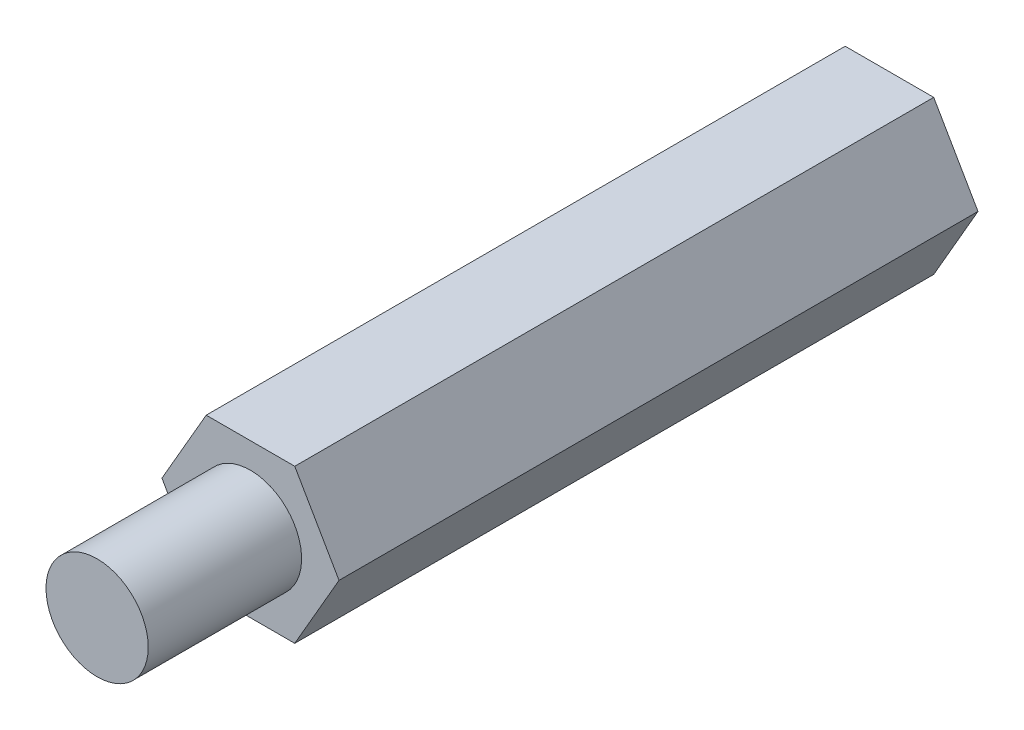
ISO-10303-21;
HEADER;
FILE_DESCRIPTION(('STEP AP214'),'2;1');
FILE_NAME('part.step','',(''),(''),'','','');
FILE_SCHEMA(('AUTOMOTIVE_DESIGN { 1 0 10303 214 1 1 1 1 }'));
ENDSEC;
DATA;
#1=APPLICATION_CONTEXT('core data for automotive mechanical design processes');
#2=APPLICATION_PROTOCOL_DEFINITION('international standard','automotive_design',2000,#1);
#3=PRODUCT_CONTEXT('',#1,'mechanical');
#4=PRODUCT('Part','Part','',(#3));
#5=PRODUCT_RELATED_PRODUCT_CATEGORY('part','',(#4));
#6=PRODUCT_DEFINITION_FORMATION('','',#4);
#7=PRODUCT_DEFINITION_CONTEXT('part definition',#1,'design');
#8=PRODUCT_DEFINITION('design','',#6,#7);
#9=PRODUCT_DEFINITION_SHAPE('','',#8);
#10=(LENGTH_UNIT() NAMED_UNIT(*) SI_UNIT(.MILLI.,.METRE.));
#11=(NAMED_UNIT(*) PLANE_ANGLE_UNIT() SI_UNIT($,.RADIAN.));
#12=(NAMED_UNIT(*) SI_UNIT($,.STERADIAN.) SOLID_ANGLE_UNIT());
#13=UNCERTAINTY_MEASURE_WITH_UNIT(LENGTH_MEASURE(1.E-05),#10,'distance_accuracy_value','');
#14=(GEOMETRIC_REPRESENTATION_CONTEXT(3) GLOBAL_UNCERTAINTY_ASSIGNED_CONTEXT((#13)) GLOBAL_UNIT_ASSIGNED_CONTEXT((#10,
#11,#12)) REPRESENTATION_CONTEXT('',''));
#15=CARTESIAN_POINT('',(0.,0.,0.));
#16=DIRECTION('',(0.,0.,1.));
#17=DIRECTION('',(1.,0.,0.));
#18=AXIS2_PLACEMENT_3D('',#15,#16,#17);
#19=CARTESIAN_POINT('',(-5.19615242270663,-3.,25.));
#20=DIRECTION('',(0.,0.,-1.));
#21=DIRECTION('',(-1.,0.,0.));
#22=AXIS2_PLACEMENT_3D('',#19,#20,#21);
#23=PLANE('',#22);
#24=DIRECTION('',(1.,0.,0.));
#25=VECTOR('',#24,1.);
#26=CARTESIAN_POINT('',(-1.73205080756888,-3.,25.));
#27=LINE('',#26,#25);
#28=CARTESIAN_POINT('',(-1.73205080756888,-3.,25.));
#29=VERTEX_POINT('',#28);
#30=CARTESIAN_POINT('',(1.73205080756888,-3.,25.));
#31=VERTEX_POINT('',#30);
#32=EDGE_CURVE('E138',#29,#31,#27,.T.);
#33=ORIENTED_EDGE('',*,*,#32,.T.);
#34=DIRECTION('',(0.5,0.866025403784439,0.));
#35=VECTOR('',#34,1.);
#36=CARTESIAN_POINT('',(1.73205080756888,-3.,25.));
#37=LINE('',#36,#35);
#38=CARTESIAN_POINT('',(3.46410161513776,0.,25.));
#39=VERTEX_POINT('',#38);
#40=EDGE_CURVE('E95',#31,#39,#37,.T.);
#41=ORIENTED_EDGE('',*,*,#40,.T.);
#42=DIRECTION('',(-0.5,0.866025403784438,0.));
#43=VECTOR('',#42,1.);
#44=CARTESIAN_POINT('',(3.46410161513776,0.,25.));
#45=LINE('',#44,#43);
#46=CARTESIAN_POINT('',(1.73205080756888,3.,25.));
#47=VERTEX_POINT('',#46);
#48=EDGE_CURVE('E109',#39,#47,#45,.T.);
#49=ORIENTED_EDGE('',*,*,#48,.T.);
#50=DIRECTION('',(-1.,0.,0.));
#51=VECTOR('',#50,1.);
#52=CARTESIAN_POINT('',(1.73205080756888,3.,25.));
#53=LINE('',#52,#51);
#54=CARTESIAN_POINT('',(-1.73205080756888,3.,25.));
#55=VERTEX_POINT('',#54);
#56=EDGE_CURVE('E103',#47,#55,#53,.T.);
#57=ORIENTED_EDGE('',*,*,#56,.T.);
#58=DIRECTION('',(-0.5,-0.866025403784439,0.));
#59=VECTOR('',#58,1.);
#60=CARTESIAN_POINT('',(-1.73205080756888,3.,25.));
#61=LINE('',#60,#59);
#62=CARTESIAN_POINT('',(-3.46410161513775,0.,25.));
#63=VERTEX_POINT('',#62);
#64=EDGE_CURVE('E107',#55,#63,#61,.T.);
#65=ORIENTED_EDGE('',*,*,#64,.T.);
#66=DIRECTION('',(0.5,-0.866025403784438,0.));
#67=VECTOR('',#66,1.);
#68=CARTESIAN_POINT('',(-3.46410161513775,0.,25.));
#69=LINE('',#68,#67);
#70=EDGE_CURVE('E56',#63,#29,#69,.T.);
#71=ORIENTED_EDGE('',*,*,#70,.T.);
#72=EDGE_LOOP('',(#33,#41,#49,#57,#65,#71));
#73=FACE_BOUND('',#72,.T.);
#74=CARTESIAN_POINT('',(0.,0.,25.));
#75=DIRECTION('',(0.,0.,-1.));
#76=DIRECTION('',(-1.,0.,0.));
#77=AXIS2_PLACEMENT_3D('',#74,#75,#76);
#78=CIRCLE('',#77,2.);
#79=CARTESIAN_POINT('',(-2.,0.,25.));
#80=VERTEX_POINT('',#79);
#81=EDGE_CURVE('E11',#80,#80,#78,.F.);
#82=ORIENTED_EDGE('',*,*,#81,.F.);
#83=EDGE_LOOP('',(#82));
#84=FACE_BOUND('',#83,.T.);
#85=ADVANCED_FACE('F39',(#73,#84),#23,.F.);
#86=CARTESIAN_POINT('',(-1.73205080756888,-3.,25.));
#87=DIRECTION('',(0.,1.,0.));
#88=DIRECTION('',(0.,0.,1.));
#89=AXIS2_PLACEMENT_3D('',#86,#87,#88);
#90=PLANE('',#89);
#91=DIRECTION('',(1.,0.,0.));
#92=VECTOR('',#91,1.);
#93=CARTESIAN_POINT('',(-1.73205080756888,-3.,0.));
#94=LINE('',#93,#92);
#95=CARTESIAN_POINT('',(-1.73205080756888,-3.,0.));
#96=VERTEX_POINT('',#95);
#97=CARTESIAN_POINT('',(1.73205080756888,-3.,0.));
#98=VERTEX_POINT('',#97);
#99=EDGE_CURVE('E127',#96,#98,#94,.T.);
#100=ORIENTED_EDGE('',*,*,#99,.T.);
#101=DIRECTION('',(0.,0.,-1.));
#102=VECTOR('',#101,1.);
#103=CARTESIAN_POINT('',(1.73205080756888,-3.,25.));
#104=LINE('',#103,#102);
#105=EDGE_CURVE('E48',#31,#98,#104,.T.);
#106=ORIENTED_EDGE('',*,*,#105,.F.);
#107=ORIENTED_EDGE('',*,*,#32,.F.);
#108=DIRECTION('',(0.,0.,-1.));
#109=VECTOR('',#108,1.);
#110=CARTESIAN_POINT('',(-1.73205080756888,-3.,25.));
#111=LINE('',#110,#109);
#112=EDGE_CURVE('E123',#29,#96,#111,.T.);
#113=ORIENTED_EDGE('',*,*,#112,.T.);
#114=EDGE_LOOP('',(#100,#106,#107,#113));
#115=FACE_BOUND('',#114,.T.);
#116=ADVANCED_FACE('F41',(#115),#90,.F.);
#117=CARTESIAN_POINT('',(1.73205080756888,-3.,25.));
#118=DIRECTION('',(-0.866025403784439,0.5,0.));
#119=DIRECTION('',(-0.5,-0.866025403784439,0.));
#120=AXIS2_PLACEMENT_3D('',#117,#118,#119);
#121=PLANE('',#120);
#122=DIRECTION('',(0.5,0.866025403784439,0.));
#123=VECTOR('',#122,1.);
#124=CARTESIAN_POINT('',(1.73205080756888,-3.,0.));
#125=LINE('',#124,#123);
#126=CARTESIAN_POINT('',(3.46410161513776,0.,0.));
#127=VERTEX_POINT('',#126);
#128=EDGE_CURVE('E130',#98,#127,#125,.T.);
#129=ORIENTED_EDGE('',*,*,#128,.T.);
#130=DIRECTION('',(0.,0.,-1.));
#131=VECTOR('',#130,1.);
#132=CARTESIAN_POINT('',(3.46410161513776,0.,25.));
#133=LINE('',#132,#131);
#134=EDGE_CURVE('E142',#39,#127,#133,.T.);
#135=ORIENTED_EDGE('',*,*,#134,.F.);
#136=ORIENTED_EDGE('',*,*,#40,.F.);
#137=ORIENTED_EDGE('',*,*,#105,.T.);
#138=EDGE_LOOP('',(#129,#135,#136,#137));
#139=FACE_BOUND('',#138,.T.);
#140=ADVANCED_FACE('F145',(#139),#121,.F.);
#141=CARTESIAN_POINT('',(3.46410161513776,0.,25.));
#142=DIRECTION('',(-0.866025403784438,-0.5,0.));
#143=DIRECTION('',(0.5,-0.866025403784438,0.));
#144=AXIS2_PLACEMENT_3D('',#141,#142,#143);
#145=PLANE('',#144);
#146=DIRECTION('',(-0.5,0.866025403784438,0.));
#147=VECTOR('',#146,1.);
#148=CARTESIAN_POINT('',(3.46410161513776,0.,0.));
#149=LINE('',#148,#147);
#150=CARTESIAN_POINT('',(1.73205080756888,3.,0.));
#151=VERTEX_POINT('',#150);
#152=EDGE_CURVE('E133',#127,#151,#149,.T.);
#153=ORIENTED_EDGE('',*,*,#152,.T.);
#154=DIRECTION('',(0.,0.,-1.));
#155=VECTOR('',#154,1.);
#156=CARTESIAN_POINT('',(1.73205080756888,3.,25.));
#157=LINE('',#156,#155);
#158=EDGE_CURVE('E118',#47,#151,#157,.T.);
#159=ORIENTED_EDGE('',*,*,#158,.F.);
#160=ORIENTED_EDGE('',*,*,#48,.F.);
#161=ORIENTED_EDGE('',*,*,#134,.T.);
#162=EDGE_LOOP('',(#153,#159,#160,#161));
#163=FACE_BOUND('',#162,.T.);
#164=ADVANCED_FACE('F153',(#163),#145,.F.);
#165=CARTESIAN_POINT('',(1.73205080756888,3.,25.));
#166=DIRECTION('',(0.,-1.,0.));
#167=DIRECTION('',(1.,0.,0.));
#168=AXIS2_PLACEMENT_3D('',#165,#166,#167);
#169=PLANE('',#168);
#170=DIRECTION('',(-1.,0.,0.));
#171=VECTOR('',#170,1.);
#172=CARTESIAN_POINT('',(1.73205080756888,3.,0.));
#173=LINE('',#172,#171);
#174=CARTESIAN_POINT('',(-1.73205080756888,3.,0.));
#175=VERTEX_POINT('',#174);
#176=EDGE_CURVE('E117',#151,#175,#173,.T.);
#177=ORIENTED_EDGE('',*,*,#176,.T.);
#178=DIRECTION('',(0.,0.,-1.));
#179=VECTOR('',#178,1.);
#180=CARTESIAN_POINT('',(-1.73205080756888,3.,25.));
#181=LINE('',#180,#179);
#182=EDGE_CURVE('E114',#55,#175,#181,.T.);
#183=ORIENTED_EDGE('',*,*,#182,.F.);
#184=ORIENTED_EDGE('',*,*,#56,.F.);
#185=ORIENTED_EDGE('',*,*,#158,.T.);
#186=EDGE_LOOP('',(#177,#183,#184,#185));
#187=FACE_BOUND('',#186,.T.);
#188=ADVANCED_FACE('F115',(#187),#169,.F.);
#189=CARTESIAN_POINT('',(-1.73205080756888,3.,25.));
#190=DIRECTION('',(0.866025403784439,-0.5,0.));
#191=DIRECTION('',(0.5,0.866025403784439,0.));
#192=AXIS2_PLACEMENT_3D('',#189,#190,#191);
#193=PLANE('',#192);
#194=DIRECTION('',(-0.5,-0.866025403784439,0.));
#195=VECTOR('',#194,1.);
#196=CARTESIAN_POINT('',(-1.73205080756888,3.,0.));
#197=LINE('',#196,#195);
#198=CARTESIAN_POINT('',(-3.46410161513775,0.,0.));
#199=VERTEX_POINT('',#198);
#200=EDGE_CURVE('E80',#175,#199,#197,.T.);
#201=ORIENTED_EDGE('',*,*,#200,.T.);
#202=DIRECTION('',(0.,0.,-1.));
#203=VECTOR('',#202,1.);
#204=CARTESIAN_POINT('',(-3.46410161513775,0.,25.));
#205=LINE('',#204,#203);
#206=EDGE_CURVE('E119',#63,#199,#205,.T.);
#207=ORIENTED_EDGE('',*,*,#206,.F.);
#208=ORIENTED_EDGE('',*,*,#64,.F.);
#209=ORIENTED_EDGE('',*,*,#182,.T.);
#210=EDGE_LOOP('',(#201,#207,#208,#209));
#211=FACE_BOUND('',#210,.T.);
#212=ADVANCED_FACE('F121',(#211),#193,.F.);
#213=CARTESIAN_POINT('',(-3.46410161513775,0.,25.));
#214=DIRECTION('',(0.866025403784438,0.5,0.));
#215=DIRECTION('',(-0.5,0.866025403784439,0.));
#216=AXIS2_PLACEMENT_3D('',#213,#214,#215);
#217=PLANE('',#216);
#218=DIRECTION('',(0.5,-0.866025403784438,0.));
#219=VECTOR('',#218,1.);
#220=CARTESIAN_POINT('',(-3.46410161513775,0.,0.));
#221=LINE('',#220,#219);
#222=EDGE_CURVE('E86',#199,#96,#221,.T.);
#223=ORIENTED_EDGE('',*,*,#222,.T.);
#224=ORIENTED_EDGE('',*,*,#112,.F.);
#225=ORIENTED_EDGE('',*,*,#70,.F.);
#226=ORIENTED_EDGE('',*,*,#206,.T.);
#227=EDGE_LOOP('',(#223,#224,#225,#226));
#228=FACE_BOUND('',#227,.T.);
#229=ADVANCED_FACE('F177',(#228),#217,.F.);
#230=CARTESIAN_POINT('',(-5.19615242270663,-3.,0.));
#231=DIRECTION('',(0.,0.,-1.));
#232=DIRECTION('',(-1.,0.,0.));
#233=AXIS2_PLACEMENT_3D('',#230,#231,#232);
#234=PLANE('',#233);
#235=CARTESIAN_POINT('',(0.,0.,0.));
#236=DIRECTION('',(0.,0.,-1.));
#237=DIRECTION('',(-1.,0.,0.));
#238=AXIS2_PLACEMENT_3D('',#235,#236,#237);
#239=CIRCLE('',#238,1.65);
#240=CARTESIAN_POINT('',(-1.65,0.,0.));
#241=VERTEX_POINT('',#240);
#242=EDGE_CURVE('E159',#241,#241,#239,.T.);
#243=ORIENTED_EDGE('',*,*,#242,.F.);
#244=EDGE_LOOP('',(#243));
#245=FACE_BOUND('',#244,.T.);
#246=ORIENTED_EDGE('',*,*,#99,.F.);
#247=ORIENTED_EDGE('',*,*,#222,.F.);
#248=ORIENTED_EDGE('',*,*,#200,.F.);
#249=ORIENTED_EDGE('',*,*,#176,.F.);
#250=ORIENTED_EDGE('',*,*,#152,.F.);
#251=ORIENTED_EDGE('',*,*,#128,.F.);
#252=EDGE_LOOP('',(#246,#247,#248,#249,#250,#251));
#253=FACE_BOUND('',#252,.T.);
#254=ADVANCED_FACE('F150',(#245,#253),#234,.T.);
#255=CARTESIAN_POINT('',(0.,0.,31.));
#256=DIRECTION('',(0.,0.,-1.));
#257=DIRECTION('',(-1.,0.,0.));
#258=AXIS2_PLACEMENT_3D('',#255,#256,#257);
#259=CYLINDRICAL_SURFACE('',#258,2.);
#260=CARTESIAN_POINT('',(0.,0.,31.));
#261=DIRECTION('',(0.,0.,1.));
#262=DIRECTION('',(1.,0.,0.));
#263=AXIS2_PLACEMENT_3D('',#260,#261,#262);
#264=CIRCLE('',#263,2.);
#265=CARTESIAN_POINT('',(2.,0.,31.));
#266=VERTEX_POINT('',#265);
#267=EDGE_CURVE('E131',#266,#266,#264,.T.);
#268=ORIENTED_EDGE('',*,*,#267,.F.);
#269=EDGE_LOOP('',(#268));
#270=FACE_BOUND('',#269,.T.);
#271=ORIENTED_EDGE('',*,*,#81,.T.);
#272=EDGE_LOOP('',(#271));
#273=FACE_BOUND('',#272,.T.);
#274=ADVANCED_FACE('F176',(#270,#273),#259,.T.);
#275=CARTESIAN_POINT('',(0.,0.,31.));
#276=DIRECTION('',(0.,0.,1.));
#277=DIRECTION('',(1.,0.,0.));
#278=AXIS2_PLACEMENT_3D('',#275,#276,#277);
#279=PLANE('',#278);
#280=ORIENTED_EDGE('',*,*,#267,.T.);
#281=EDGE_LOOP('',(#280));
#282=FACE_BOUND('',#281,.T.);
#283=ADVANCED_FACE('F171',(#282),#279,.T.);
#284=CARTESIAN_POINT('',(0.,0.,0.));
#285=DIRECTION('',(0.,0.,-1.));
#286=DIRECTION('',(-1.,0.,0.));
#287=AXIS2_PLACEMENT_3D('',#284,#285,#286);
#288=CYLINDRICAL_SURFACE('',#287,1.65);
#289=CARTESIAN_POINT('',(0.,0.,11.5));
#290=DIRECTION('',(0.,0.,-1.));
#291=DIRECTION('',(-1.,0.,0.));
#292=AXIS2_PLACEMENT_3D('',#289,#290,#291);
#293=CIRCLE('',#292,1.65);
#294=CARTESIAN_POINT('',(-1.65,0.,11.5));
#295=VERTEX_POINT('',#294);
#296=EDGE_CURVE('E162',#295,#295,#293,.T.);
#297=ORIENTED_EDGE('',*,*,#296,.F.);
#298=EDGE_LOOP('',(#297));
#299=FACE_BOUND('',#298,.T.);
#300=ORIENTED_EDGE('',*,*,#242,.T.);
#301=EDGE_LOOP('',(#300));
#302=FACE_BOUND('',#301,.T.);
#303=ADVANCED_FACE('F168',(#299,#302),#288,.F.);
#304=CARTESIAN_POINT('',(0.,0.,11.5));
#305=DIRECTION('',(0.,0.,-1.));
#306=DIRECTION('',(-1.,0.,0.));
#307=AXIS2_PLACEMENT_3D('',#304,#305,#306);
#308=CONICAL_SURFACE('',#307,1.65,1.02974425867665);
#309=CARTESIAN_POINT('',(0.,0.,12.4914200213955));
#310=VERTEX_POINT('',#309);
#311=VERTEX_LOOP('',#310);
#312=FACE_BOUND('',#311,.T.);
#313=ORIENTED_EDGE('',*,*,#296,.T.);
#314=EDGE_LOOP('',(#313));
#315=FACE_BOUND('',#314,.T.);
#316=ADVANCED_FACE('F166',(#312,#315),#308,.F.);
#317=CLOSED_SHELL('',(#85,#116,#140,#164,#188,#212,#229,#254,#274,#283,#303,#316));
#318=MANIFOLD_SOLID_BREP('B2',#317);
#319=ADVANCED_BREP_SHAPE_REPRESENTATION('',(#18,#318),#14);
#320=SHAPE_DEFINITION_REPRESENTATION(#9,#319);
ENDSEC;
END-ISO-10303-21;
